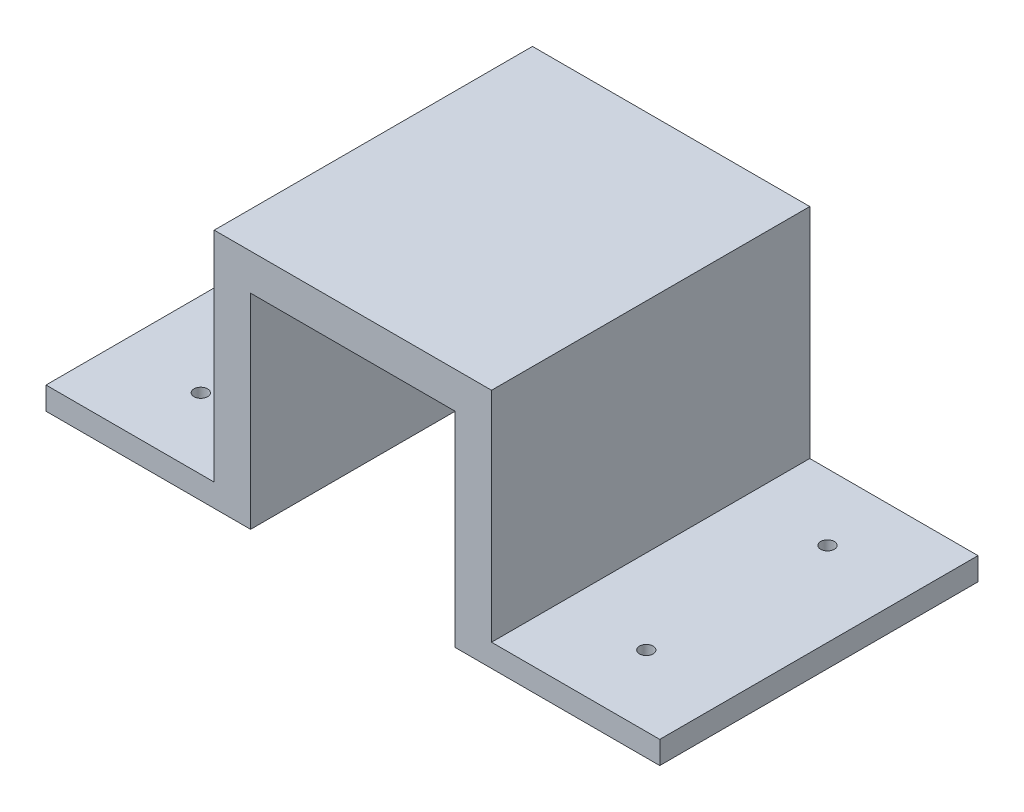
ISO-10303-21;
HEADER;
FILE_DESCRIPTION(('STEP AP214'),'2;1');
FILE_NAME('part.step','',(''),(''),'','','');
FILE_SCHEMA(('AUTOMOTIVE_DESIGN { 1 0 10303 214 1 1 1 1 }'));
ENDSEC;
DATA;
#1=APPLICATION_CONTEXT('core data for automotive mechanical design processes');
#2=APPLICATION_PROTOCOL_DEFINITION('international standard','automotive_design',2000,#1);
#3=PRODUCT_CONTEXT('',#1,'mechanical');
#4=PRODUCT('Part','Part','',(#3));
#5=PRODUCT_RELATED_PRODUCT_CATEGORY('part','',(#4));
#6=PRODUCT_DEFINITION_FORMATION('','',#4);
#7=PRODUCT_DEFINITION_CONTEXT('part definition',#1,'design');
#8=PRODUCT_DEFINITION('design','',#6,#7);
#9=PRODUCT_DEFINITION_SHAPE('','',#8);
#10=(LENGTH_UNIT() NAMED_UNIT(*) SI_UNIT(.MILLI.,.METRE.));
#11=(NAMED_UNIT(*) PLANE_ANGLE_UNIT() SI_UNIT($,.RADIAN.));
#12=(NAMED_UNIT(*) SI_UNIT($,.STERADIAN.) SOLID_ANGLE_UNIT());
#13=UNCERTAINTY_MEASURE_WITH_UNIT(LENGTH_MEASURE(1.E-05),#10,'distance_accuracy_value','');
#14=(GEOMETRIC_REPRESENTATION_CONTEXT(3) GLOBAL_UNCERTAINTY_ASSIGNED_CONTEXT((#13)) GLOBAL_UNIT_ASSIGNED_CONTEXT((#10,
#11,#12)) REPRESENTATION_CONTEXT('',''));
#15=CARTESIAN_POINT('',(0.,0.,0.));
#16=DIRECTION('',(0.,0.,1.));
#17=DIRECTION('',(1.,0.,0.));
#18=AXIS2_PLACEMENT_3D('',#15,#16,#17);
#19=CARTESIAN_POINT('',(-68.9516129032258,5.,70.));
#20=DIRECTION('',(1.,0.,0.));
#21=DIRECTION('',(0.,0.,-1.));
#22=AXIS2_PLACEMENT_3D('',#19,#20,#21);
#23=PLANE('',#22);
#24=DIRECTION('',(0.,-1.,0.));
#25=VECTOR('',#24,1.);
#26=CARTESIAN_POINT('',(-68.9516129032258,5.,0.));
#27=LINE('',#26,#25);
#28=CARTESIAN_POINT('',(-68.9516129032258,5.,0.));
#29=VERTEX_POINT('',#28);
#30=CARTESIAN_POINT('',(-68.9516129032258,0.,0.));
#31=VERTEX_POINT('',#30);
#32=EDGE_CURVE('E155',#29,#31,#27,.T.);
#33=ORIENTED_EDGE('',*,*,#32,.T.);
#34=DIRECTION('',(0.,0.,-1.));
#35=VECTOR('',#34,1.);
#36=CARTESIAN_POINT('',(-68.9516129032258,0.,70.));
#37=LINE('',#36,#35);
#38=CARTESIAN_POINT('',(-68.9516129032258,0.,70.));
#39=VERTEX_POINT('',#38);
#40=EDGE_CURVE('E11',#39,#31,#37,.T.);
#41=ORIENTED_EDGE('',*,*,#40,.F.);
#42=DIRECTION('',(0.,-1.,0.));
#43=VECTOR('',#42,1.);
#44=CARTESIAN_POINT('',(-68.9516129032258,5.,70.));
#45=LINE('',#44,#43);
#46=CARTESIAN_POINT('',(-68.9516129032258,5.,70.));
#47=VERTEX_POINT('',#46);
#48=EDGE_CURVE('E178',#47,#39,#45,.T.);
#49=ORIENTED_EDGE('',*,*,#48,.F.);
#50=DIRECTION('',(0.,0.,-1.));
#51=VECTOR('',#50,1.);
#52=CARTESIAN_POINT('',(-68.9516129032258,5.,70.));
#53=LINE('',#52,#51);
#54=EDGE_CURVE('E151',#47,#29,#53,.T.);
#55=ORIENTED_EDGE('',*,*,#54,.T.);
#56=EDGE_LOOP('',(#33,#41,#49,#55));
#57=FACE_BOUND('',#56,.T.);
#58=ADVANCED_FACE('F35',(#57),#23,.F.);
#59=CARTESIAN_POINT('',(-68.9516129032258,0.,70.));
#60=DIRECTION('',(0.,1.,0.));
#61=DIRECTION('',(0.,0.,1.));
#62=AXIS2_PLACEMENT_3D('',#59,#60,#61);
#63=PLANE('',#62);
#64=CARTESIAN_POINT('',(-50.4516129032258,0.,54.4554683894787));
#65=DIRECTION('',(0.,1.,0.));
#66=DIRECTION('',(0.,0.,1.));
#67=AXIS2_PLACEMENT_3D('',#64,#65,#66);
#68=CIRCLE('',#67,1.5);
#69=CARTESIAN_POINT('',(-50.4516129032258,0.,55.9554683894787));
#70=VERTEX_POINT('',#69);
#71=EDGE_CURVE('E392',#70,#70,#68,.T.);
#72=ORIENTED_EDGE('',*,*,#71,.T.);
#73=EDGE_LOOP('',(#72));
#74=FACE_BOUND('',#73,.T.);
#75=CARTESIAN_POINT('',(-50.4516129032258,0.,14.6031379787727));
#76=DIRECTION('',(0.,1.,0.));
#77=DIRECTION('',(0.,0.,1.));
#78=AXIS2_PLACEMENT_3D('',#75,#76,#77);
#79=CIRCLE('',#78,1.5);
#80=CARTESIAN_POINT('',(-50.4516129032258,0.,16.1031379787727));
#81=VERTEX_POINT('',#80);
#82=EDGE_CURVE('E159',#81,#81,#79,.T.);
#83=ORIENTED_EDGE('',*,*,#82,.T.);
#84=EDGE_LOOP('',(#83));
#85=FACE_BOUND('',#84,.T.);
#86=DIRECTION('',(1.,0.,0.));
#87=VECTOR('',#86,1.);
#88=CARTESIAN_POINT('',(-68.9516129032258,0.,0.));
#89=LINE('',#88,#87);
#90=CARTESIAN_POINT('',(-23.9516129032258,0.,0.));
#91=VERTEX_POINT('',#90);
#92=EDGE_CURVE('E158',#31,#91,#89,.T.);
#93=ORIENTED_EDGE('',*,*,#92,.T.);
#94=DIRECTION('',(0.,0.,-1.));
#95=VECTOR('',#94,1.);
#96=CARTESIAN_POINT('',(-23.9516129032258,0.,70.));
#97=LINE('',#96,#95);
#98=CARTESIAN_POINT('',(-23.9516129032258,0.,70.));
#99=VERTEX_POINT('',#98);
#100=EDGE_CURVE('E43',#99,#91,#97,.T.);
#101=ORIENTED_EDGE('',*,*,#100,.F.);
#102=DIRECTION('',(1.,0.,0.));
#103=VECTOR('',#102,1.);
#104=CARTESIAN_POINT('',(-68.9516129032258,0.,70.));
#105=LINE('',#104,#103);
#106=EDGE_CURVE('E106',#39,#99,#105,.T.);
#107=ORIENTED_EDGE('',*,*,#106,.F.);
#108=ORIENTED_EDGE('',*,*,#40,.T.);
#109=EDGE_LOOP('',(#93,#101,#107,#108));
#110=FACE_BOUND('',#109,.T.);
#111=ADVANCED_FACE('F259',(#74,#85,#110),#63,.F.);
#112=CARTESIAN_POINT('',(-23.9516129032258,0.,70.));
#113=DIRECTION('',(-1.,0.,0.));
#114=DIRECTION('',(0.,-1.,0.));
#115=AXIS2_PLACEMENT_3D('',#112,#113,#114);
#116=PLANE('',#115);
#117=DIRECTION('',(0.,1.,0.));
#118=VECTOR('',#117,1.);
#119=CARTESIAN_POINT('',(-23.9516129032258,0.,0.));
#120=LINE('',#119,#118);
#121=CARTESIAN_POINT('',(-23.9516129032258,45.,0.));
#122=VERTEX_POINT('',#121);
#123=EDGE_CURVE('E161',#91,#122,#120,.T.);
#124=ORIENTED_EDGE('',*,*,#123,.T.);
#125=DIRECTION('',(0.,0.,-1.));
#126=VECTOR('',#125,1.);
#127=CARTESIAN_POINT('',(-23.9516129032258,45.,70.));
#128=LINE('',#127,#126);
#129=CARTESIAN_POINT('',(-23.9516129032258,45.,70.));
#130=VERTEX_POINT('',#129);
#131=EDGE_CURVE('E197',#130,#122,#128,.T.);
#132=ORIENTED_EDGE('',*,*,#131,.F.);
#133=DIRECTION('',(0.,1.,0.));
#134=VECTOR('',#133,1.);
#135=CARTESIAN_POINT('',(-23.9516129032258,0.,70.));
#136=LINE('',#135,#134);
#137=EDGE_CURVE('E205',#99,#130,#136,.T.);
#138=ORIENTED_EDGE('',*,*,#137,.F.);
#139=ORIENTED_EDGE('',*,*,#100,.T.);
#140=EDGE_LOOP('',(#124,#132,#138,#139));
#141=FACE_BOUND('',#140,.T.);
#142=ADVANCED_FACE('F203',(#141),#116,.F.);
#143=CARTESIAN_POINT('',(-23.9516129032258,45.,70.));
#144=DIRECTION('',(0.,1.,0.));
#145=DIRECTION('',(0.,0.,1.));
#146=AXIS2_PLACEMENT_3D('',#143,#144,#145);
#147=PLANE('',#146);
#148=DIRECTION('',(1.,0.,0.));
#149=VECTOR('',#148,1.);
#150=CARTESIAN_POINT('',(-23.9516129032258,45.,0.));
#151=LINE('',#150,#149);
#152=CARTESIAN_POINT('',(21.0483870967742,45.,0.));
#153=VERTEX_POINT('',#152);
#154=EDGE_CURVE('E163',#122,#153,#151,.T.);
#155=ORIENTED_EDGE('',*,*,#154,.T.);
#156=DIRECTION('',(0.,0.,-1.));
#157=VECTOR('',#156,1.);
#158=CARTESIAN_POINT('',(21.0483870967742,45.,70.));
#159=LINE('',#158,#157);
#160=CARTESIAN_POINT('',(21.0483870967742,45.,70.));
#161=VERTEX_POINT('',#160);
#162=EDGE_CURVE('E194',#161,#153,#159,.T.);
#163=ORIENTED_EDGE('',*,*,#162,.F.);
#164=DIRECTION('',(1.,0.,0.));
#165=VECTOR('',#164,1.);
#166=CARTESIAN_POINT('',(-23.9516129032258,45.,70.));
#167=LINE('',#166,#165);
#168=EDGE_CURVE('E223',#130,#161,#167,.T.);
#169=ORIENTED_EDGE('',*,*,#168,.F.);
#170=ORIENTED_EDGE('',*,*,#131,.T.);
#171=EDGE_LOOP('',(#155,#163,#169,#170));
#172=FACE_BOUND('',#171,.T.);
#173=ADVANCED_FACE('F214',(#172),#147,.F.);
#174=CARTESIAN_POINT('',(21.0483870967742,45.,70.));
#175=DIRECTION('',(1.,0.,0.));
#176=DIRECTION('',(0.,1.,0.));
#177=AXIS2_PLACEMENT_3D('',#174,#175,#176);
#178=PLANE('',#177);
#179=DIRECTION('',(0.,-1.,0.));
#180=VECTOR('',#179,1.);
#181=CARTESIAN_POINT('',(21.0483870967742,45.,0.));
#182=LINE('',#181,#180);
#183=CARTESIAN_POINT('',(21.0483870967742,0.,0.));
#184=VERTEX_POINT('',#183);
#185=EDGE_CURVE('E165',#153,#184,#182,.T.);
#186=ORIENTED_EDGE('',*,*,#185,.T.);
#187=DIRECTION('',(0.,0.,-1.));
#188=VECTOR('',#187,1.);
#189=CARTESIAN_POINT('',(21.0483870967742,0.,70.));
#190=LINE('',#189,#188);
#191=CARTESIAN_POINT('',(21.0483870967742,0.,70.));
#192=VERTEX_POINT('',#191);
#193=EDGE_CURVE('E191',#192,#184,#190,.T.);
#194=ORIENTED_EDGE('',*,*,#193,.F.);
#195=DIRECTION('',(0.,-1.,0.));
#196=VECTOR('',#195,1.);
#197=CARTESIAN_POINT('',(21.0483870967742,45.,70.));
#198=LINE('',#197,#196);
#199=EDGE_CURVE('E220',#161,#192,#198,.T.);
#200=ORIENTED_EDGE('',*,*,#199,.F.);
#201=ORIENTED_EDGE('',*,*,#162,.T.);
#202=EDGE_LOOP('',(#186,#194,#200,#201));
#203=FACE_BOUND('',#202,.T.);
#204=ADVANCED_FACE('F218',(#203),#178,.F.);
#205=CARTESIAN_POINT('',(21.0483870967742,0.,70.));
#206=DIRECTION('',(0.,1.,0.));
#207=DIRECTION('',(0.,0.,1.));
#208=AXIS2_PLACEMENT_3D('',#205,#206,#207);
#209=PLANE('',#208);
#210=CARTESIAN_POINT('',(47.5483870967742,0.,14.6031379787727));
#211=DIRECTION('',(0.,1.,0.));
#212=DIRECTION('',(0.,0.,1.));
#213=AXIS2_PLACEMENT_3D('',#210,#211,#212);
#214=CIRCLE('',#213,1.5);
#215=CARTESIAN_POINT('',(47.5483870967742,0.,16.1031379787727));
#216=VERTEX_POINT('',#215);
#217=EDGE_CURVE('E385',#216,#216,#214,.T.);
#218=ORIENTED_EDGE('',*,*,#217,.T.);
#219=EDGE_LOOP('',(#218));
#220=FACE_BOUND('',#219,.T.);
#221=CARTESIAN_POINT('',(47.5483870967742,0.,54.4554683894787));
#222=DIRECTION('',(0.,1.,0.));
#223=DIRECTION('',(0.,0.,1.));
#224=AXIS2_PLACEMENT_3D('',#221,#222,#223);
#225=CIRCLE('',#224,1.5);
#226=CARTESIAN_POINT('',(47.5483870967742,0.,55.9554683894787));
#227=VERTEX_POINT('',#226);
#228=EDGE_CURVE('E387',#227,#227,#225,.T.);
#229=ORIENTED_EDGE('',*,*,#228,.T.);
#230=EDGE_LOOP('',(#229));
#231=FACE_BOUND('',#230,.T.);
#232=DIRECTION('',(1.,0.,0.));
#233=VECTOR('',#232,1.);
#234=CARTESIAN_POINT('',(21.0483870967742,0.,0.));
#235=LINE('',#234,#233);
#236=CARTESIAN_POINT('',(66.0483870967742,0.,0.));
#237=VERTEX_POINT('',#236);
#238=EDGE_CURVE('E167',#184,#237,#235,.T.);
#239=ORIENTED_EDGE('',*,*,#238,.T.);
#240=DIRECTION('',(0.,0.,-1.));
#241=VECTOR('',#240,1.);
#242=CARTESIAN_POINT('',(66.0483870967742,0.,70.));
#243=LINE('',#242,#241);
#244=CARTESIAN_POINT('',(66.0483870967742,0.,70.));
#245=VERTEX_POINT('',#244);
#246=EDGE_CURVE('E188',#245,#237,#243,.T.);
#247=ORIENTED_EDGE('',*,*,#246,.F.);
#248=DIRECTION('',(1.,0.,0.));
#249=VECTOR('',#248,1.);
#250=CARTESIAN_POINT('',(21.0483870967742,0.,70.));
#251=LINE('',#250,#249);
#252=EDGE_CURVE('E222',#192,#245,#251,.T.);
#253=ORIENTED_EDGE('',*,*,#252,.F.);
#254=ORIENTED_EDGE('',*,*,#193,.T.);
#255=EDGE_LOOP('',(#239,#247,#253,#254));
#256=FACE_BOUND('',#255,.T.);
#257=ADVANCED_FACE('F275',(#220,#231,#256),#209,.F.);
#258=CARTESIAN_POINT('',(66.0483870967742,0.,70.));
#259=DIRECTION('',(-1.,0.,0.));
#260=DIRECTION('',(0.,0.,1.));
#261=AXIS2_PLACEMENT_3D('',#258,#259,#260);
#262=PLANE('',#261);
#263=DIRECTION('',(0.,1.,0.));
#264=VECTOR('',#263,1.);
#265=CARTESIAN_POINT('',(66.0483870967742,0.,0.));
#266=LINE('',#265,#264);
#267=CARTESIAN_POINT('',(66.0483870967742,5.,0.));
#268=VERTEX_POINT('',#267);
#269=EDGE_CURVE('E169',#237,#268,#266,.T.);
#270=ORIENTED_EDGE('',*,*,#269,.T.);
#271=DIRECTION('',(0.,0.,-1.));
#272=VECTOR('',#271,1.);
#273=CARTESIAN_POINT('',(66.0483870967742,5.,70.));
#274=LINE('',#273,#272);
#275=CARTESIAN_POINT('',(66.0483870967742,5.,70.));
#276=VERTEX_POINT('',#275);
#277=EDGE_CURVE('E185',#276,#268,#274,.T.);
#278=ORIENTED_EDGE('',*,*,#277,.F.);
#279=DIRECTION('',(0.,1.,0.));
#280=VECTOR('',#279,1.);
#281=CARTESIAN_POINT('',(66.0483870967742,0.,70.));
#282=LINE('',#281,#280);
#283=EDGE_CURVE('E225',#245,#276,#282,.T.);
#284=ORIENTED_EDGE('',*,*,#283,.F.);
#285=ORIENTED_EDGE('',*,*,#246,.T.);
#286=EDGE_LOOP('',(#270,#278,#284,#285));
#287=FACE_BOUND('',#286,.T.);
#288=ADVANCED_FACE('F278',(#287),#262,.F.);
#289=CARTESIAN_POINT('',(66.0483870967742,5.,70.));
#290=DIRECTION('',(0.,-1.,0.));
#291=DIRECTION('',(1.,0.,0.));
#292=AXIS2_PLACEMENT_3D('',#289,#290,#291);
#293=PLANE('',#292);
#294=CARTESIAN_POINT('',(47.5483870967742,5.00000000000001,14.6031379787727));
#295=DIRECTION('',(0.,1.,0.));
#296=DIRECTION('',(-1.,0.,0.));
#297=AXIS2_PLACEMENT_3D('',#294,#295,#296);
#298=CIRCLE('',#297,1.5);
#299=CARTESIAN_POINT('',(46.0483870967742,5.00000000000001,14.6031379787727));
#300=VERTEX_POINT('',#299);
#301=EDGE_CURVE('E382',#300,#300,#298,.T.);
#302=ORIENTED_EDGE('',*,*,#301,.F.);
#303=EDGE_LOOP('',(#302));
#304=FACE_BOUND('',#303,.T.);
#305=CARTESIAN_POINT('',(47.5483870967742,5.00000000000001,54.4554683894787));
#306=DIRECTION('',(0.,1.,0.));
#307=DIRECTION('',(-1.,0.,0.));
#308=AXIS2_PLACEMENT_3D('',#305,#306,#307);
#309=CIRCLE('',#308,1.5);
#310=CARTESIAN_POINT('',(46.0483870967742,5.00000000000001,54.4554683894787));
#311=VERTEX_POINT('',#310);
#312=EDGE_CURVE('E403',#311,#311,#309,.T.);
#313=ORIENTED_EDGE('',*,*,#312,.F.);
#314=EDGE_LOOP('',(#313));
#315=FACE_BOUND('',#314,.T.);
#316=DIRECTION('',(-1.,0.,0.));
#317=VECTOR('',#316,1.);
#318=CARTESIAN_POINT('',(66.0483870967742,5.,0.));
#319=LINE('',#318,#317);
#320=CARTESIAN_POINT('',(29.0483870967742,5.,0.));
#321=VERTEX_POINT('',#320);
#322=EDGE_CURVE('E171',#268,#321,#319,.T.);
#323=ORIENTED_EDGE('',*,*,#322,.T.);
#324=DIRECTION('',(0.,0.,-1.));
#325=VECTOR('',#324,1.);
#326=CARTESIAN_POINT('',(29.0483870967742,5.,70.));
#327=LINE('',#326,#325);
#328=CARTESIAN_POINT('',(29.0483870967742,5.,70.));
#329=VERTEX_POINT('',#328);
#330=EDGE_CURVE('E182',#329,#321,#327,.T.);
#331=ORIENTED_EDGE('',*,*,#330,.F.);
#332=DIRECTION('',(-1.,0.,0.));
#333=VECTOR('',#332,1.);
#334=CARTESIAN_POINT('',(66.0483870967742,5.,70.));
#335=LINE('',#334,#333);
#336=EDGE_CURVE('E231',#276,#329,#335,.T.);
#337=ORIENTED_EDGE('',*,*,#336,.F.);
#338=ORIENTED_EDGE('',*,*,#277,.T.);
#339=EDGE_LOOP('',(#323,#331,#337,#338));
#340=FACE_BOUND('',#339,.T.);
#341=ADVANCED_FACE('F237',(#304,#315,#340),#293,.F.);
#342=CARTESIAN_POINT('',(29.0483870967742,5.,70.));
#343=DIRECTION('',(-1.,0.,0.));
#344=DIRECTION('',(0.,-1.,0.));
#345=AXIS2_PLACEMENT_3D('',#342,#343,#344);
#346=PLANE('',#345);
#347=DIRECTION('',(0.,1.,0.));
#348=VECTOR('',#347,1.);
#349=CARTESIAN_POINT('',(29.0483870967742,5.,0.));
#350=LINE('',#349,#348);
#351=CARTESIAN_POINT('',(29.0483870967742,53.,0.));
#352=VERTEX_POINT('',#351);
#353=EDGE_CURVE('E173',#321,#352,#350,.T.);
#354=ORIENTED_EDGE('',*,*,#353,.T.);
#355=DIRECTION('',(0.,0.,-1.));
#356=VECTOR('',#355,1.);
#357=CARTESIAN_POINT('',(29.0483870967742,53.,70.));
#358=LINE('',#357,#356);
#359=CARTESIAN_POINT('',(29.0483870967742,53.,70.));
#360=VERTEX_POINT('',#359);
#361=EDGE_CURVE('E146',#360,#352,#358,.T.);
#362=ORIENTED_EDGE('',*,*,#361,.F.);
#363=DIRECTION('',(0.,1.,0.));
#364=VECTOR('',#363,1.);
#365=CARTESIAN_POINT('',(29.0483870967742,5.,70.));
#366=LINE('',#365,#364);
#367=EDGE_CURVE('E137',#329,#360,#366,.T.);
#368=ORIENTED_EDGE('',*,*,#367,.F.);
#369=ORIENTED_EDGE('',*,*,#330,.T.);
#370=EDGE_LOOP('',(#354,#362,#368,#369));
#371=FACE_BOUND('',#370,.T.);
#372=ADVANCED_FACE('F241',(#371),#346,.F.);
#373=CARTESIAN_POINT('',(29.0483870967742,53.,70.));
#374=DIRECTION('',(0.,-1.,0.));
#375=DIRECTION('',(1.,0.,0.));
#376=AXIS2_PLACEMENT_3D('',#373,#374,#375);
#377=PLANE('',#376);
#378=DIRECTION('',(-1.,0.,0.));
#379=VECTOR('',#378,1.);
#380=CARTESIAN_POINT('',(29.0483870967742,53.,0.));
#381=LINE('',#380,#379);
#382=CARTESIAN_POINT('',(-31.9516129032258,53.,0.));
#383=VERTEX_POINT('',#382);
#384=EDGE_CURVE('E145',#352,#383,#381,.T.);
#385=ORIENTED_EDGE('',*,*,#384,.T.);
#386=DIRECTION('',(0.,0.,-1.));
#387=VECTOR('',#386,1.);
#388=CARTESIAN_POINT('',(-31.9516129032258,53.,70.));
#389=LINE('',#388,#387);
#390=CARTESIAN_POINT('',(-31.9516129032258,53.,70.));
#391=VERTEX_POINT('',#390);
#392=EDGE_CURVE('E142',#391,#383,#389,.T.);
#393=ORIENTED_EDGE('',*,*,#392,.F.);
#394=DIRECTION('',(-1.,0.,0.));
#395=VECTOR('',#394,1.);
#396=CARTESIAN_POINT('',(29.0483870967742,53.,70.));
#397=LINE('',#396,#395);
#398=EDGE_CURVE('E131',#360,#391,#397,.T.);
#399=ORIENTED_EDGE('',*,*,#398,.F.);
#400=ORIENTED_EDGE('',*,*,#361,.T.);
#401=EDGE_LOOP('',(#385,#393,#399,#400));
#402=FACE_BOUND('',#401,.T.);
#403=ADVANCED_FACE('F143',(#402),#377,.F.);
#404=CARTESIAN_POINT('',(-31.9516129032258,53.,70.));
#405=DIRECTION('',(1.,0.,0.));
#406=DIRECTION('',(0.,1.,0.));
#407=AXIS2_PLACEMENT_3D('',#404,#405,#406);
#408=PLANE('',#407);
#409=DIRECTION('',(0.,-1.,0.));
#410=VECTOR('',#409,1.);
#411=CARTESIAN_POINT('',(-31.9516129032258,53.,0.));
#412=LINE('',#411,#410);
#413=CARTESIAN_POINT('',(-31.9516129032258,5.,0.));
#414=VERTEX_POINT('',#413);
#415=EDGE_CURVE('E92',#383,#414,#412,.T.);
#416=ORIENTED_EDGE('',*,*,#415,.T.);
#417=DIRECTION('',(0.,0.,-1.));
#418=VECTOR('',#417,1.);
#419=CARTESIAN_POINT('',(-31.9516129032258,5.,70.));
#420=LINE('',#419,#418);
#421=CARTESIAN_POINT('',(-31.9516129032258,5.,70.));
#422=VERTEX_POINT('',#421);
#423=EDGE_CURVE('E147',#422,#414,#420,.T.);
#424=ORIENTED_EDGE('',*,*,#423,.F.);
#425=DIRECTION('',(0.,-1.,0.));
#426=VECTOR('',#425,1.);
#427=CARTESIAN_POINT('',(-31.9516129032258,53.,70.));
#428=LINE('',#427,#426);
#429=EDGE_CURVE('E135',#391,#422,#428,.T.);
#430=ORIENTED_EDGE('',*,*,#429,.F.);
#431=ORIENTED_EDGE('',*,*,#392,.T.);
#432=EDGE_LOOP('',(#416,#424,#430,#431));
#433=FACE_BOUND('',#432,.T.);
#434=ADVANCED_FACE('F149',(#433),#408,.F.);
#435=CARTESIAN_POINT('',(-31.9516129032258,5.,70.));
#436=DIRECTION('',(0.,-1.,0.));
#437=DIRECTION('',(1.,0.,0.));
#438=AXIS2_PLACEMENT_3D('',#435,#436,#437);
#439=PLANE('',#438);
#440=CARTESIAN_POINT('',(-50.4516129032258,5.,54.4554683894787));
#441=DIRECTION('',(0.,1.,0.));
#442=DIRECTION('',(-1.,0.,0.));
#443=AXIS2_PLACEMENT_3D('',#440,#441,#442);
#444=CIRCLE('',#443,1.5);
#445=CARTESIAN_POINT('',(-51.9516129032258,5.,54.4554683894787));
#446=VERTEX_POINT('',#445);
#447=EDGE_CURVE('E402',#446,#446,#444,.T.);
#448=ORIENTED_EDGE('',*,*,#447,.F.);
#449=EDGE_LOOP('',(#448));
#450=FACE_BOUND('',#449,.T.);
#451=CARTESIAN_POINT('',(-50.4516129032258,5.,14.6031379787727));
#452=DIRECTION('',(0.,1.,0.));
#453=DIRECTION('',(-1.,0.,0.));
#454=AXIS2_PLACEMENT_3D('',#451,#452,#453);
#455=CIRCLE('',#454,1.5);
#456=CARTESIAN_POINT('',(-51.9516129032258,5.,14.6031379787727));
#457=VERTEX_POINT('',#456);
#458=EDGE_CURVE('E386',#457,#457,#455,.T.);
#459=ORIENTED_EDGE('',*,*,#458,.F.);
#460=EDGE_LOOP('',(#459));
#461=FACE_BOUND('',#460,.T.);
#462=DIRECTION('',(-1.,0.,0.));
#463=VECTOR('',#462,1.);
#464=CARTESIAN_POINT('',(-31.9516129032258,5.,0.));
#465=LINE('',#464,#463);
#466=EDGE_CURVE('E98',#414,#29,#465,.T.);
#467=ORIENTED_EDGE('',*,*,#466,.T.);
#468=ORIENTED_EDGE('',*,*,#54,.F.);
#469=DIRECTION('',(-1.,0.,0.));
#470=VECTOR('',#469,1.);
#471=CARTESIAN_POINT('',(-31.9516129032258,5.,70.));
#472=LINE('',#471,#470);
#473=EDGE_CURVE('E51',#422,#47,#472,.T.);
#474=ORIENTED_EDGE('',*,*,#473,.F.);
#475=ORIENTED_EDGE('',*,*,#423,.T.);
#476=EDGE_LOOP('',(#467,#468,#474,#475));
#477=FACE_BOUND('',#476,.T.);
#478=ADVANCED_FACE('F245',(#450,#461,#477),#439,.F.);
#479=CARTESIAN_POINT('',(0.,0.,70.));
#480=DIRECTION('',(0.,0.,1.));
#481=DIRECTION('',(1.,0.,0.));
#482=AXIS2_PLACEMENT_3D('',#479,#480,#481);
#483=PLANE('',#482);
#484=ORIENTED_EDGE('',*,*,#48,.T.);
#485=ORIENTED_EDGE('',*,*,#106,.T.);
#486=ORIENTED_EDGE('',*,*,#137,.T.);
#487=ORIENTED_EDGE('',*,*,#168,.T.);
#488=ORIENTED_EDGE('',*,*,#199,.T.);
#489=ORIENTED_EDGE('',*,*,#252,.T.);
#490=ORIENTED_EDGE('',*,*,#283,.T.);
#491=ORIENTED_EDGE('',*,*,#336,.T.);
#492=ORIENTED_EDGE('',*,*,#367,.T.);
#493=ORIENTED_EDGE('',*,*,#398,.T.);
#494=ORIENTED_EDGE('',*,*,#429,.T.);
#495=ORIENTED_EDGE('',*,*,#473,.T.);
#496=EDGE_LOOP('',(#484,#485,#486,#487,#488,#489,#490,#491,#492,#493,#494,#495));
#497=FACE_BOUND('',#496,.T.);
#498=ADVANCED_FACE('F133',(#497),#483,.T.);
#499=CARTESIAN_POINT('',(0.,0.,0.));
#500=DIRECTION('',(0.,0.,1.));
#501=DIRECTION('',(1.,0.,0.));
#502=AXIS2_PLACEMENT_3D('',#499,#500,#501);
#503=PLANE('',#502);
#504=ORIENTED_EDGE('',*,*,#32,.F.);
#505=ORIENTED_EDGE('',*,*,#466,.F.);
#506=ORIENTED_EDGE('',*,*,#415,.F.);
#507=ORIENTED_EDGE('',*,*,#384,.F.);
#508=ORIENTED_EDGE('',*,*,#353,.F.);
#509=ORIENTED_EDGE('',*,*,#322,.F.);
#510=ORIENTED_EDGE('',*,*,#269,.F.);
#511=ORIENTED_EDGE('',*,*,#238,.F.);
#512=ORIENTED_EDGE('',*,*,#185,.F.);
#513=ORIENTED_EDGE('',*,*,#154,.F.);
#514=ORIENTED_EDGE('',*,*,#123,.F.);
#515=ORIENTED_EDGE('',*,*,#92,.F.);
#516=EDGE_LOOP('',(#504,#505,#506,#507,#508,#509,#510,#511,#512,#513,#514,#515));
#517=FACE_BOUND('',#516,.T.);
#518=ADVANCED_FACE('F209',(#517),#503,.F.);
#519=CARTESIAN_POINT('',(-50.4516129032258,-65.,14.6031379787727));
#520=DIRECTION('',(0.,1.,0.));
#521=DIRECTION('',(-1.,0.,0.));
#522=AXIS2_PLACEMENT_3D('',#519,#520,#521);
#523=CYLINDRICAL_SURFACE('',#522,1.5);
#524=ORIENTED_EDGE('',*,*,#458,.T.);
#525=EDGE_LOOP('',(#524));
#526=FACE_BOUND('',#525,.T.);
#527=ORIENTED_EDGE('',*,*,#82,.F.);
#528=EDGE_LOOP('',(#527));
#529=FACE_BOUND('',#528,.T.);
#530=ADVANCED_FACE('F312',(#526,#529),#523,.F.);
#531=CARTESIAN_POINT('',(-50.4516129032258,-65.,54.4554683894787));
#532=DIRECTION('',(0.,1.,0.));
#533=DIRECTION('',(-1.,0.,0.));
#534=AXIS2_PLACEMENT_3D('',#531,#532,#533);
#535=CYLINDRICAL_SURFACE('',#534,1.5);
#536=ORIENTED_EDGE('',*,*,#447,.T.);
#537=EDGE_LOOP('',(#536));
#538=FACE_BOUND('',#537,.T.);
#539=ORIENTED_EDGE('',*,*,#71,.F.);
#540=EDGE_LOOP('',(#539));
#541=FACE_BOUND('',#540,.T.);
#542=ADVANCED_FACE('F345',(#538,#541),#535,.F.);
#543=CARTESIAN_POINT('',(47.5483870967742,-65.,54.4554683894787));
#544=DIRECTION('',(0.,1.,0.));
#545=DIRECTION('',(-1.,0.,0.));
#546=AXIS2_PLACEMENT_3D('',#543,#544,#545);
#547=CYLINDRICAL_SURFACE('',#546,1.5);
#548=ORIENTED_EDGE('',*,*,#312,.T.);
#549=EDGE_LOOP('',(#548));
#550=FACE_BOUND('',#549,.T.);
#551=ORIENTED_EDGE('',*,*,#228,.F.);
#552=EDGE_LOOP('',(#551));
#553=FACE_BOUND('',#552,.T.);
#554=ADVANCED_FACE('F355',(#550,#553),#547,.F.);
#555=CARTESIAN_POINT('',(47.5483870967742,-65.,14.6031379787727));
#556=DIRECTION('',(0.,1.,0.));
#557=DIRECTION('',(-1.,0.,0.));
#558=AXIS2_PLACEMENT_3D('',#555,#556,#557);
#559=CYLINDRICAL_SURFACE('',#558,1.5);
#560=ORIENTED_EDGE('',*,*,#301,.T.);
#561=EDGE_LOOP('',(#560));
#562=FACE_BOUND('',#561,.T.);
#563=ORIENTED_EDGE('',*,*,#217,.F.);
#564=EDGE_LOOP('',(#563));
#565=FACE_BOUND('',#564,.T.);
#566=ADVANCED_FACE('F365',(#562,#565),#559,.F.);
#567=CLOSED_SHELL('',(#58,#111,#142,#173,#204,#257,#288,#341,#372,#403,#434,#478,#498,#518,#530,
#542,#554,#566));
#568=MANIFOLD_SOLID_BREP('B2',#567);
#569=ADVANCED_BREP_SHAPE_REPRESENTATION('',(#18,#568),#14);
#570=SHAPE_DEFINITION_REPRESENTATION(#9,#569);
ENDSEC;
END-ISO-10303-21;
